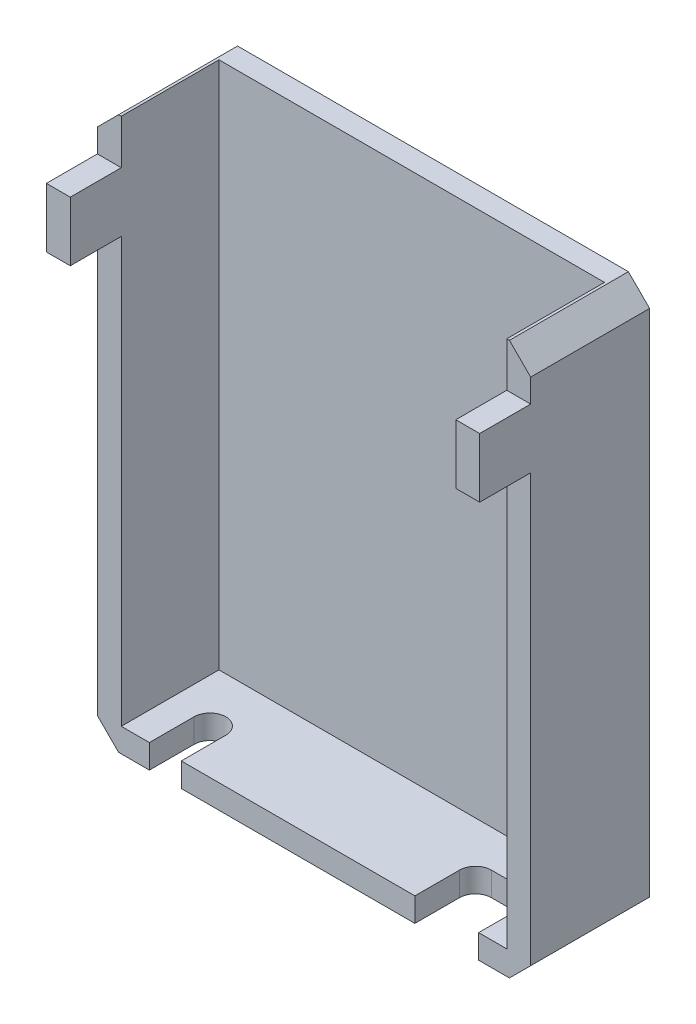
ISO-10303-21;
HEADER;
FILE_DESCRIPTION(('STEP AP214'),'2;1');
FILE_NAME('part.step','',(''),(''),'','','');
FILE_SCHEMA(('AUTOMOTIVE_DESIGN { 1 0 10303 214 1 1 1 1 }'));
ENDSEC;
DATA;
#1=APPLICATION_CONTEXT('core data for automotive mechanical design processes');
#2=APPLICATION_PROTOCOL_DEFINITION('international standard','automotive_design',2000,#1);
#3=PRODUCT_CONTEXT('',#1,'mechanical');
#4=PRODUCT('Part','Part','',(#3));
#5=PRODUCT_RELATED_PRODUCT_CATEGORY('part','',(#4));
#6=PRODUCT_DEFINITION_FORMATION('','',#4);
#7=PRODUCT_DEFINITION_CONTEXT('part definition',#1,'design');
#8=PRODUCT_DEFINITION('design','',#6,#7);
#9=PRODUCT_DEFINITION_SHAPE('','',#8);
#10=(LENGTH_UNIT() NAMED_UNIT(*) SI_UNIT(.MILLI.,.METRE.));
#11=(NAMED_UNIT(*) PLANE_ANGLE_UNIT() SI_UNIT($,.RADIAN.));
#12=(NAMED_UNIT(*) SI_UNIT($,.STERADIAN.) SOLID_ANGLE_UNIT());
#13=UNCERTAINTY_MEASURE_WITH_UNIT(LENGTH_MEASURE(1.E-05),#10,'distance_accuracy_value','');
#14=(GEOMETRIC_REPRESENTATION_CONTEXT(3) GLOBAL_UNCERTAINTY_ASSIGNED_CONTEXT((#13)) GLOBAL_UNIT_ASSIGNED_CONTEXT((#10,
#11,#12)) REPRESENTATION_CONTEXT('',''));
#15=CARTESIAN_POINT('',(0.,0.,0.));
#16=DIRECTION('',(0.,0.,1.));
#17=DIRECTION('',(1.,0.,0.));
#18=AXIS2_PLACEMENT_3D('',#15,#16,#17);
#19=CARTESIAN_POINT('',(0.,0.,5.6));
#20=DIRECTION('',(0.,0.,1.));
#21=DIRECTION('',(1.,0.,0.));
#22=AXIS2_PLACEMENT_3D('',#19,#20,#21);
#23=PLANE('',#22);
#24=DIRECTION('',(0.,-1.,0.));
#25=VECTOR('',#24,1.);
#26=CARTESIAN_POINT('',(9.07500000000001,13.,5.6));
#27=LINE('',#26,#25);
#28=CARTESIAN_POINT('',(9.07500000000001,13.,5.6));
#29=VERTEX_POINT('',#28);
#30=CARTESIAN_POINT('',(9.07500000000001,10.9,5.6));
#31=VERTEX_POINT('',#30);
#32=EDGE_CURVE('E243',#29,#31,#27,.T.);
#33=ORIENTED_EDGE('',*,*,#32,.T.);
#34=DIRECTION('',(-1.,0.,0.));
#35=VECTOR('',#34,1.);
#36=CARTESIAN_POINT('',(9.07500000000001,10.9,5.6));
#37=LINE('',#36,#35);
#38=CARTESIAN_POINT('',(10.2,10.9,5.6));
#39=VERTEX_POINT('',#38);
#40=EDGE_CURVE('E49',#39,#31,#37,.T.);
#41=ORIENTED_EDGE('',*,*,#40,.F.);
#42=DIRECTION('',(0.,1.,0.));
#43=VECTOR('',#42,1.);
#44=CARTESIAN_POINT('',(10.2,-13.,5.6));
#45=LINE('',#44,#43);
#46=CARTESIAN_POINT('',(10.2,12.,5.6));
#47=VERTEX_POINT('',#46);
#48=EDGE_CURVE('E373',#39,#47,#45,.T.);
#49=ORIENTED_EDGE('',*,*,#48,.T.);
#50=DIRECTION('',(0.707106781186546,-0.707106781186549,0.));
#51=VECTOR('',#50,1.);
#52=CARTESIAN_POINT('',(11.1,11.1,5.6));
#53=LINE('',#52,#51);
#54=CARTESIAN_POINT('',(9.2,13.,5.6));
#55=VERTEX_POINT('',#54);
#56=EDGE_CURVE('E437',#47,#55,#53,.F.);
#57=ORIENTED_EDGE('',*,*,#56,.T.);
#58=DIRECTION('',(-1.,0.,0.));
#59=VECTOR('',#58,1.);
#60=CARTESIAN_POINT('',(10.2,13.,5.6));
#61=LINE('',#60,#59);
#62=EDGE_CURVE('E244',#55,#29,#61,.T.);
#63=ORIENTED_EDGE('',*,*,#62,.T.);
#64=EDGE_LOOP('',(#33,#41,#49,#57,#63));
#65=FACE_BOUND('',#64,.T.);
#66=ADVANCED_FACE('F34',(#65),#23,.T.);
#67=CARTESIAN_POINT('',(10.2,-12.,5.6));
#68=VERTEX_POINT('',#67);
#69=CARTESIAN_POINT('',(10.2,8.10000000000001,5.6));
#70=VERTEX_POINT('',#69);
#71=EDGE_CURVE('E57',#68,#70,#45,.T.);
#72=ORIENTED_EDGE('',*,*,#71,.T.);
#73=DIRECTION('',(1.,0.,0.));
#74=VECTOR('',#73,1.);
#75=CARTESIAN_POINT('',(9.07500000000001,8.10000000000001,5.6));
#76=LINE('',#75,#74);
#77=CARTESIAN_POINT('',(9.07500000000001,8.10000000000001,5.6));
#78=VERTEX_POINT('',#77);
#79=EDGE_CURVE('E247',#78,#70,#76,.T.);
#80=ORIENTED_EDGE('',*,*,#79,.F.);
#81=CARTESIAN_POINT('',(9.07500000000001,-11.875,5.6));
#82=VERTEX_POINT('',#81);
#83=EDGE_CURVE('E232',#78,#82,#27,.T.);
#84=ORIENTED_EDGE('',*,*,#83,.T.);
#85=DIRECTION('',(-1.,0.,0.));
#86=VECTOR('',#85,1.);
#87=CARTESIAN_POINT('',(9.07500000000001,-11.875,5.6));
#88=LINE('',#87,#86);
#89=CARTESIAN_POINT('',(7.75,-11.875,5.6));
#90=VERTEX_POINT('',#89);
#91=EDGE_CURVE('E378',#82,#90,#88,.T.);
#92=ORIENTED_EDGE('',*,*,#91,.T.);
#93=DIRECTION('',(0.,-1.,0.));
#94=VECTOR('',#93,1.);
#95=CARTESIAN_POINT('',(7.75,13.001,5.6));
#96=LINE('',#95,#94);
#97=CARTESIAN_POINT('',(7.75,-13.,5.6));
#98=VERTEX_POINT('',#97);
#99=EDGE_CURVE('E323',#90,#98,#96,.T.);
#100=ORIENTED_EDGE('',*,*,#99,.T.);
#101=DIRECTION('',(1.,0.,0.));
#102=VECTOR('',#101,1.);
#103=CARTESIAN_POINT('',(-10.2,-13.,5.6));
#104=LINE('',#103,#102);
#105=CARTESIAN_POINT('',(9.2,-13.,5.6));
#106=VERTEX_POINT('',#105);
#107=EDGE_CURVE('E369',#98,#106,#104,.T.);
#108=ORIENTED_EDGE('',*,*,#107,.T.);
#109=DIRECTION('',(-0.707106781186548,-0.707106781186548,0.));
#110=VECTOR('',#109,1.);
#111=CARTESIAN_POINT('',(11.1,-11.1,5.6));
#112=LINE('',#111,#110);
#113=EDGE_CURVE('E435',#106,#68,#112,.F.);
#114=ORIENTED_EDGE('',*,*,#113,.T.);
#115=EDGE_LOOP('',(#72,#80,#84,#92,#100,#108,#114));
#116=FACE_BOUND('',#115,.T.);
#117=ADVANCED_FACE('F248',(#116),#23,.T.);
#118=DIRECTION('',(0.,-1.,0.));
#119=VECTOR('',#118,1.);
#120=CARTESIAN_POINT('',(-10.2,13.,5.6));
#121=LINE('',#120,#119);
#122=CARTESIAN_POINT('',(-10.2,12.,5.6));
#123=VERTEX_POINT('',#122);
#124=CARTESIAN_POINT('',(-10.2,10.9,5.6));
#125=VERTEX_POINT('',#124);
#126=EDGE_CURVE('E367',#123,#125,#121,.T.);
#127=ORIENTED_EDGE('',*,*,#126,.T.);
#128=DIRECTION('',(-1.,0.,0.));
#129=VECTOR('',#128,1.);
#130=CARTESIAN_POINT('',(-10.2,10.9,5.6));
#131=LINE('',#130,#129);
#132=CARTESIAN_POINT('',(-9.075,10.9,5.6));
#133=VERTEX_POINT('',#132);
#134=EDGE_CURVE('E278',#133,#125,#131,.T.);
#135=ORIENTED_EDGE('',*,*,#134,.F.);
#136=DIRECTION('',(0.,1.,0.));
#137=VECTOR('',#136,1.);
#138=CARTESIAN_POINT('',(-9.075,-11.875,5.6));
#139=LINE('',#138,#137);
#140=CARTESIAN_POINT('',(-9.075,13.,5.6));
#141=VERTEX_POINT('',#140);
#142=EDGE_CURVE('E380',#133,#141,#139,.T.);
#143=ORIENTED_EDGE('',*,*,#142,.T.);
#144=DIRECTION('',(-1.,0.,0.));
#145=VECTOR('',#144,1.);
#146=CARTESIAN_POINT('',(-9.075,13.,5.6));
#147=LINE('',#146,#145);
#148=CARTESIAN_POINT('',(-9.19999999999999,13.,5.6));
#149=VERTEX_POINT('',#148);
#150=EDGE_CURVE('E362',#141,#149,#147,.T.);
#151=ORIENTED_EDGE('',*,*,#150,.T.);
#152=DIRECTION('',(0.707106781186548,0.707106781186548,0.));
#153=VECTOR('',#152,1.);
#154=CARTESIAN_POINT('',(-11.1,11.1,5.6));
#155=LINE('',#154,#153);
#156=EDGE_CURVE('E439',#149,#123,#155,.F.);
#157=ORIENTED_EDGE('',*,*,#156,.T.);
#158=EDGE_LOOP('',(#127,#135,#143,#151,#157));
#159=FACE_BOUND('',#158,.T.);
#160=ADVANCED_FACE('F552',(#159),#23,.T.);
#161=CARTESIAN_POINT('',(-9.075,-11.875,5.6));
#162=VERTEX_POINT('',#161);
#163=CARTESIAN_POINT('',(-9.075,8.10000000000001,5.6));
#164=VERTEX_POINT('',#163);
#165=EDGE_CURVE('E382',#162,#164,#139,.T.);
#166=ORIENTED_EDGE('',*,*,#165,.T.);
#167=DIRECTION('',(1.,0.,0.));
#168=VECTOR('',#167,1.);
#169=CARTESIAN_POINT('',(-10.2,8.10000000000001,5.6));
#170=LINE('',#169,#168);
#171=CARTESIAN_POINT('',(-10.2,8.10000000000001,5.6));
#172=VERTEX_POINT('',#171);
#173=EDGE_CURVE('E275',#172,#164,#170,.T.);
#174=ORIENTED_EDGE('',*,*,#173,.F.);
#175=CARTESIAN_POINT('',(-10.2,-12.,5.6));
#176=VERTEX_POINT('',#175);
#177=EDGE_CURVE('E365',#172,#176,#121,.T.);
#178=ORIENTED_EDGE('',*,*,#177,.T.);
#179=DIRECTION('',(-0.707106781186546,0.707106781186549,0.));
#180=VECTOR('',#179,1.);
#181=CARTESIAN_POINT('',(-11.1,-11.1,5.6));
#182=LINE('',#181,#180);
#183=CARTESIAN_POINT('',(-9.19999999999999,-13.,5.6));
#184=VERTEX_POINT('',#183);
#185=EDGE_CURVE('E433',#176,#184,#182,.F.);
#186=ORIENTED_EDGE('',*,*,#185,.T.);
#187=CARTESIAN_POINT('',(-7.75,-13.,5.6));
#188=VERTEX_POINT('',#187);
#189=EDGE_CURVE('E370',#184,#188,#104,.T.);
#190=ORIENTED_EDGE('',*,*,#189,.T.);
#191=DIRECTION('',(0.,-1.,0.));
#192=VECTOR('',#191,1.);
#193=CARTESIAN_POINT('',(-7.75,13.001,5.6));
#194=LINE('',#193,#192);
#195=CARTESIAN_POINT('',(-7.75,-11.875,5.6));
#196=VERTEX_POINT('',#195);
#197=EDGE_CURVE('E350',#196,#188,#194,.T.);
#198=ORIENTED_EDGE('',*,*,#197,.F.);
#199=EDGE_CURVE('E377',#196,#162,#88,.T.);
#200=ORIENTED_EDGE('',*,*,#199,.T.);
#201=EDGE_LOOP('',(#166,#174,#178,#186,#190,#198,#200));
#202=FACE_BOUND('',#201,.T.);
#203=ADVANCED_FACE('F529',(#202),#23,.T.);
#204=CARTESIAN_POINT('',(-10.2,13.,1.));
#205=DIRECTION('',(1.,0.,0.));
#206=DIRECTION('',(0.,1.,0.));
#207=AXIS2_PLACEMENT_3D('',#204,#205,#206);
#208=PLANE('',#207);
#209=ORIENTED_EDGE('',*,*,#126,.F.);
#210=DIRECTION('',(0.,0.,-1.));
#211=VECTOR('',#210,1.);
#212=CARTESIAN_POINT('',(-10.2,12.,1.));
#213=LINE('',#212,#211);
#214=CARTESIAN_POINT('',(-10.2,12.,0.));
#215=VERTEX_POINT('',#214);
#216=EDGE_CURVE('E417',#123,#215,#213,.T.);
#217=ORIENTED_EDGE('',*,*,#216,.T.);
#218=DIRECTION('',(0.,-1.,0.));
#219=VECTOR('',#218,1.);
#220=CARTESIAN_POINT('',(-10.2,13.,0.));
#221=LINE('',#220,#219);
#222=CARTESIAN_POINT('',(-10.2,-12.,0.));
#223=VERTEX_POINT('',#222);
#224=EDGE_CURVE('E400',#215,#223,#221,.T.);
#225=ORIENTED_EDGE('',*,*,#224,.T.);
#226=DIRECTION('',(0.,0.,1.));
#227=VECTOR('',#226,1.);
#228=CARTESIAN_POINT('',(-10.2,-12.,1.));
#229=LINE('',#228,#227);
#230=EDGE_CURVE('E403',#223,#176,#229,.T.);
#231=ORIENTED_EDGE('',*,*,#230,.T.);
#232=ORIENTED_EDGE('',*,*,#177,.F.);
#233=DIRECTION('',(0.,0.,-1.));
#234=VECTOR('',#233,1.);
#235=CARTESIAN_POINT('',(-10.2,8.10000000000001,11.1175528164392));
#236=LINE('',#235,#234);
#237=CARTESIAN_POINT('',(-10.2,8.10000000000001,8.));
#238=VERTEX_POINT('',#237);
#239=EDGE_CURVE('E291',#238,#172,#236,.T.);
#240=ORIENTED_EDGE('',*,*,#239,.F.);
#241=DIRECTION('',(0.,1.,0.));
#242=VECTOR('',#241,1.);
#243=CARTESIAN_POINT('',(-10.2,10.9,8.));
#244=LINE('',#243,#242);
#245=CARTESIAN_POINT('',(-10.2,10.9,8.));
#246=VERTEX_POINT('',#245);
#247=EDGE_CURVE('E271',#238,#246,#244,.T.);
#248=ORIENTED_EDGE('',*,*,#247,.T.);
#249=DIRECTION('',(0.,0.,-1.));
#250=VECTOR('',#249,1.);
#251=CARTESIAN_POINT('',(-10.2,10.9,11.1175528164392));
#252=LINE('',#251,#250);
#253=EDGE_CURVE('E282',#246,#125,#252,.T.);
#254=ORIENTED_EDGE('',*,*,#253,.T.);
#255=EDGE_LOOP('',(#209,#217,#225,#231,#232,#240,#248,#254));
#256=FACE_BOUND('',#255,.T.);
#257=ADVANCED_FACE('F566',(#256),#208,.F.);
#258=CARTESIAN_POINT('',(-10.2,-13.,1.));
#259=DIRECTION('',(0.,1.,0.));
#260=DIRECTION('',(0.,0.,1.));
#261=AXIS2_PLACEMENT_3D('',#258,#259,#260);
#262=PLANE('',#261);
#263=ORIENTED_EDGE('',*,*,#107,.F.);
#264=DIRECTION('',(0.,0.,1.));
#265=VECTOR('',#264,1.);
#266=CARTESIAN_POINT('',(7.75,-13.,3.5));
#267=LINE('',#266,#265);
#268=CARTESIAN_POINT('',(7.75,-13.,3.5));
#269=VERTEX_POINT('',#268);
#270=EDGE_CURVE('E309',#269,#98,#267,.T.);
#271=ORIENTED_EDGE('',*,*,#270,.F.);
#272=CARTESIAN_POINT('',(7.,-13.,3.5));
#273=DIRECTION('',(0.,-1.,0.));
#274=DIRECTION('',(0.,0.,-1.));
#275=AXIS2_PLACEMENT_3D('',#272,#273,#274);
#276=CIRCLE('',#275,0.75);
#277=CARTESIAN_POINT('',(7.,-13.,2.75));
#278=VERTEX_POINT('',#277);
#279=EDGE_CURVE('E320',#278,#269,#276,.T.);
#280=ORIENTED_EDGE('',*,*,#279,.F.);
#281=DIRECTION('',(1.,0.,0.));
#282=VECTOR('',#281,1.);
#283=CARTESIAN_POINT('',(7.,-13.,2.75));
#284=LINE('',#283,#282);
#285=CARTESIAN_POINT('',(5.5,-13.,2.75));
#286=VERTEX_POINT('',#285);
#287=EDGE_CURVE('E317',#286,#278,#284,.T.);
#288=ORIENTED_EDGE('',*,*,#287,.F.);
#289=CARTESIAN_POINT('',(5.5,-13.,3.5));
#290=DIRECTION('',(0.,-1.,0.));
#291=DIRECTION('',(0.,0.,-1.));
#292=AXIS2_PLACEMENT_3D('',#289,#290,#291);
#293=CIRCLE('',#292,0.75);
#294=CARTESIAN_POINT('',(4.75,-13.,3.5));
#295=VERTEX_POINT('',#294);
#296=EDGE_CURVE('E314',#295,#286,#293,.T.);
#297=ORIENTED_EDGE('',*,*,#296,.F.);
#298=DIRECTION('',(0.,0.,-1.));
#299=VECTOR('',#298,1.);
#300=CARTESIAN_POINT('',(4.75,-13.,5.6));
#301=LINE('',#300,#299);
#302=CARTESIAN_POINT('',(4.75,-13.,5.6));
#303=VERTEX_POINT('',#302);
#304=EDGE_CURVE('E311',#303,#295,#301,.T.);
#305=ORIENTED_EDGE('',*,*,#304,.F.);
#306=CARTESIAN_POINT('',(-6.25,-13.,5.6));
#307=VERTEX_POINT('',#306);
#308=EDGE_CURVE('E374',#307,#303,#104,.T.);
#309=ORIENTED_EDGE('',*,*,#308,.F.);
#310=DIRECTION('',(0.,0.,1.));
#311=VECTOR('',#310,1.);
#312=CARTESIAN_POINT('',(-6.25,-13.,5.6));
#313=LINE('',#312,#311);
#314=CARTESIAN_POINT('',(-6.25,-13.,3.5));
#315=VERTEX_POINT('',#314);
#316=EDGE_CURVE('E347',#315,#307,#313,.T.);
#317=ORIENTED_EDGE('',*,*,#316,.F.);
#318=CARTESIAN_POINT('',(-7.,-13.,3.5));
#319=DIRECTION('',(0.,-1.,0.));
#320=DIRECTION('',(0.,0.,-1.));
#321=AXIS2_PLACEMENT_3D('',#318,#319,#320);
#322=CIRCLE('',#321,0.75);
#323=CARTESIAN_POINT('',(-7.75,-13.,3.5));
#324=VERTEX_POINT('',#323);
#325=EDGE_CURVE('E344',#324,#315,#322,.T.);
#326=ORIENTED_EDGE('',*,*,#325,.F.);
#327=DIRECTION('',(0.,0.,-1.));
#328=VECTOR('',#327,1.);
#329=CARTESIAN_POINT('',(-7.75,-13.,5.6));
#330=LINE('',#329,#328);
#331=EDGE_CURVE('E341',#188,#324,#330,.T.);
#332=ORIENTED_EDGE('',*,*,#331,.F.);
#333=ORIENTED_EDGE('',*,*,#189,.F.);
#334=DIRECTION('',(0.,0.,-1.));
#335=VECTOR('',#334,1.);
#336=CARTESIAN_POINT('',(-9.19999999999999,-13.,1.));
#337=LINE('',#336,#335);
#338=CARTESIAN_POINT('',(-9.19999999999999,-13.,0.));
#339=VERTEX_POINT('',#338);
#340=EDGE_CURVE('E42',#184,#339,#337,.T.);
#341=ORIENTED_EDGE('',*,*,#340,.T.);
#342=DIRECTION('',(1.,0.,0.));
#343=VECTOR('',#342,1.);
#344=CARTESIAN_POINT('',(-10.2,-13.,0.));
#345=LINE('',#344,#343);
#346=CARTESIAN_POINT('',(9.2,-13.,0.));
#347=VERTEX_POINT('',#346);
#348=EDGE_CURVE('E407',#339,#347,#345,.T.);
#349=ORIENTED_EDGE('',*,*,#348,.T.);
#350=DIRECTION('',(0.,0.,1.));
#351=VECTOR('',#350,1.);
#352=CARTESIAN_POINT('',(9.2,-13.,1.));
#353=LINE('',#352,#351);
#354=EDGE_CURVE('E12',#347,#106,#353,.T.);
#355=ORIENTED_EDGE('',*,*,#354,.T.);
#356=EDGE_LOOP('',(#263,#271,#280,#288,#297,#305,#309,#317,#326,#332,#333,#341,#349,#355));
#357=FACE_BOUND('',#356,.T.);
#358=ADVANCED_FACE('F452',(#357),#262,.F.);
#359=CARTESIAN_POINT('',(10.2,13.,1.));
#360=DIRECTION('',(-1.,0.,0.));
#361=DIRECTION('',(0.,0.,1.));
#362=AXIS2_PLACEMENT_3D('',#359,#360,#361);
#363=PLANE('',#362);
#364=DIRECTION('',(0.,1.,0.));
#365=VECTOR('',#364,1.);
#366=CARTESIAN_POINT('',(10.2,13.,0.));
#367=LINE('',#366,#365);
#368=CARTESIAN_POINT('',(10.2,-12.,0.));
#369=VERTEX_POINT('',#368);
#370=CARTESIAN_POINT('',(10.2,12.,0.));
#371=VERTEX_POINT('',#370);
#372=EDGE_CURVE('E410',#369,#371,#367,.T.);
#373=ORIENTED_EDGE('',*,*,#372,.T.);
#374=DIRECTION('',(0.,0.,1.));
#375=VECTOR('',#374,1.);
#376=CARTESIAN_POINT('',(10.2,12.,1.));
#377=LINE('',#376,#375);
#378=EDGE_CURVE('E444',#371,#47,#377,.T.);
#379=ORIENTED_EDGE('',*,*,#378,.T.);
#380=ORIENTED_EDGE('',*,*,#48,.F.);
#381=DIRECTION('',(0.,0.,-1.));
#382=VECTOR('',#381,1.);
#383=CARTESIAN_POINT('',(10.2,10.9,11.1175528164392));
#384=LINE('',#383,#382);
#385=CARTESIAN_POINT('',(10.2,10.9,8.));
#386=VERTEX_POINT('',#385);
#387=EDGE_CURVE('E260',#386,#39,#384,.T.);
#388=ORIENTED_EDGE('',*,*,#387,.F.);
#389=DIRECTION('',(0.,-1.,0.));
#390=VECTOR('',#389,1.);
#391=CARTESIAN_POINT('',(10.2,10.9,8.));
#392=LINE('',#391,#390);
#393=CARTESIAN_POINT('',(10.2,8.10000000000001,8.));
#394=VERTEX_POINT('',#393);
#395=EDGE_CURVE('E258',#386,#394,#392,.T.);
#396=ORIENTED_EDGE('',*,*,#395,.T.);
#397=DIRECTION('',(0.,0.,-1.));
#398=VECTOR('',#397,1.);
#399=CARTESIAN_POINT('',(10.2,8.10000000000001,11.1175528164392));
#400=LINE('',#399,#398);
#401=EDGE_CURVE('E255',#394,#70,#400,.T.);
#402=ORIENTED_EDGE('',*,*,#401,.T.);
#403=ORIENTED_EDGE('',*,*,#71,.F.);
#404=DIRECTION('',(0.,0.,-1.));
#405=VECTOR('',#404,1.);
#406=CARTESIAN_POINT('',(10.2,-12.,1.));
#407=LINE('',#406,#405);
#408=EDGE_CURVE('E441',#68,#369,#407,.T.);
#409=ORIENTED_EDGE('',*,*,#408,.T.);
#410=EDGE_LOOP('',(#373,#379,#380,#388,#396,#402,#403,#409));
#411=FACE_BOUND('',#410,.T.);
#412=ADVANCED_FACE('F466',(#411),#363,.F.);
#413=CARTESIAN_POINT('',(-10.2,13.,1.));
#414=DIRECTION('',(0.,-1.,0.));
#415=DIRECTION('',(0.,0.,-1.));
#416=AXIS2_PLACEMENT_3D('',#413,#414,#415);
#417=PLANE('',#416);
#418=DIRECTION('',(-1.,0.,0.));
#419=VECTOR('',#418,1.);
#420=CARTESIAN_POINT('',(-10.2,13.,0.));
#421=LINE('',#420,#419);
#422=CARTESIAN_POINT('',(9.2,13.,0.));
#423=VERTEX_POINT('',#422);
#424=CARTESIAN_POINT('',(-9.19999999999999,13.,0.));
#425=VERTEX_POINT('',#424);
#426=EDGE_CURVE('E404',#423,#425,#421,.T.);
#427=ORIENTED_EDGE('',*,*,#426,.T.);
#428=DIRECTION('',(0.,0.,1.));
#429=VECTOR('',#428,1.);
#430=CARTESIAN_POINT('',(-9.19999999999999,13.,1.));
#431=LINE('',#430,#429);
#432=EDGE_CURVE('E431',#425,#149,#431,.T.);
#433=ORIENTED_EDGE('',*,*,#432,.T.);
#434=ORIENTED_EDGE('',*,*,#150,.F.);
#435=DIRECTION('',(0.,0.,-1.));
#436=VECTOR('',#435,1.);
#437=CARTESIAN_POINT('',(-9.075,13.,5.6));
#438=LINE('',#437,#436);
#439=CARTESIAN_POINT('',(-9.075,13.,1.));
#440=VERTEX_POINT('',#439);
#441=EDGE_CURVE('E384',#141,#440,#438,.T.);
#442=ORIENTED_EDGE('',*,*,#441,.T.);
#443=DIRECTION('',(-1.,0.,0.));
#444=VECTOR('',#443,1.);
#445=CARTESIAN_POINT('',(-10.2,13.,1.));
#446=LINE('',#445,#444);
#447=CARTESIAN_POINT('',(9.07500000000001,13.,1.));
#448=VERTEX_POINT('',#447);
#449=EDGE_CURVE('E401',#448,#440,#446,.T.);
#450=ORIENTED_EDGE('',*,*,#449,.F.);
#451=DIRECTION('',(0.,0.,-1.));
#452=VECTOR('',#451,1.);
#453=CARTESIAN_POINT('',(9.07500000000001,13.,5.6));
#454=LINE('',#453,#452);
#455=EDGE_CURVE('E397',#29,#448,#454,.T.);
#456=ORIENTED_EDGE('',*,*,#455,.F.);
#457=ORIENTED_EDGE('',*,*,#62,.F.);
#458=DIRECTION('',(0.,0.,-1.));
#459=VECTOR('',#458,1.);
#460=CARTESIAN_POINT('',(9.2,13.,1.));
#461=LINE('',#460,#459);
#462=EDGE_CURVE('E428',#55,#423,#461,.T.);
#463=ORIENTED_EDGE('',*,*,#462,.T.);
#464=EDGE_LOOP('',(#427,#433,#434,#442,#450,#456,#457,#463));
#465=FACE_BOUND('',#464,.T.);
#466=ADVANCED_FACE('F490',(#465),#417,.F.);
#467=CARTESIAN_POINT('',(0.,0.,1.));
#468=DIRECTION('',(0.,0.,1.));
#469=DIRECTION('',(1.,0.,0.));
#470=AXIS2_PLACEMENT_3D('',#467,#468,#469);
#471=PLANE('',#470);
#472=DIRECTION('',(0.,1.,0.));
#473=VECTOR('',#472,1.);
#474=CARTESIAN_POINT('',(-9.075,-11.875,1.));
#475=LINE('',#474,#473);
#476=CARTESIAN_POINT('',(-9.075,-11.875,1.));
#477=VERTEX_POINT('',#476);
#478=EDGE_CURVE('E366',#477,#440,#475,.T.);
#479=ORIENTED_EDGE('',*,*,#478,.F.);
#480=DIRECTION('',(-1.,0.,0.));
#481=VECTOR('',#480,1.);
#482=CARTESIAN_POINT('',(9.07500000000001,-11.875,1.));
#483=LINE('',#482,#481);
#484=CARTESIAN_POINT('',(9.07500000000001,-11.875,1.));
#485=VERTEX_POINT('',#484);
#486=EDGE_CURVE('E386',#485,#477,#483,.T.);
#487=ORIENTED_EDGE('',*,*,#486,.F.);
#488=DIRECTION('',(0.,-1.,0.));
#489=VECTOR('',#488,1.);
#490=CARTESIAN_POINT('',(9.07500000000001,13.,1.));
#491=LINE('',#490,#489);
#492=EDGE_CURVE('E361',#448,#485,#491,.T.);
#493=ORIENTED_EDGE('',*,*,#492,.F.);
#494=ORIENTED_EDGE('',*,*,#449,.T.);
#495=EDGE_LOOP('',(#479,#487,#493,#494));
#496=FACE_BOUND('',#495,.T.);
#497=ADVANCED_FACE('F494',(#496),#471,.T.);
#498=CARTESIAN_POINT('',(0.,0.,0.));
#499=DIRECTION('',(0.,0.,1.));
#500=DIRECTION('',(1.,0.,0.));
#501=AXIS2_PLACEMENT_3D('',#498,#499,#500);
#502=PLANE('',#501);
#503=ORIENTED_EDGE('',*,*,#224,.F.);
#504=DIRECTION('',(-0.707106781186548,-0.707106781186548,0.));
#505=VECTOR('',#504,1.);
#506=CARTESIAN_POINT('',(-10.2,12.,0.));
#507=LINE('',#506,#505);
#508=EDGE_CURVE('E426',#215,#425,#507,.F.);
#509=ORIENTED_EDGE('',*,*,#508,.T.);
#510=ORIENTED_EDGE('',*,*,#426,.F.);
#511=DIRECTION('',(-0.707106781186546,0.707106781186549,0.));
#512=VECTOR('',#511,1.);
#513=CARTESIAN_POINT('',(9.2,13.,0.));
#514=LINE('',#513,#512);
#515=EDGE_CURVE('E424',#423,#371,#514,.F.);
#516=ORIENTED_EDGE('',*,*,#515,.T.);
#517=ORIENTED_EDGE('',*,*,#372,.F.);
#518=DIRECTION('',(0.707106781186548,0.707106781186548,0.));
#519=VECTOR('',#518,1.);
#520=CARTESIAN_POINT('',(10.2,-12.,0.));
#521=LINE('',#520,#519);
#522=EDGE_CURVE('E422',#369,#347,#521,.F.);
#523=ORIENTED_EDGE('',*,*,#522,.T.);
#524=ORIENTED_EDGE('',*,*,#348,.F.);
#525=DIRECTION('',(0.707106781186546,-0.707106781186549,0.));
#526=VECTOR('',#525,1.);
#527=CARTESIAN_POINT('',(-9.19999999999999,-13.,0.));
#528=LINE('',#527,#526);
#529=EDGE_CURVE('E420',#339,#223,#528,.F.);
#530=ORIENTED_EDGE('',*,*,#529,.T.);
#531=EDGE_LOOP('',(#503,#509,#510,#516,#517,#523,#524,#530));
#532=FACE_BOUND('',#531,.T.);
#533=ADVANCED_FACE('F459',(#532),#502,.F.);
#534=CARTESIAN_POINT('',(9.07500000000001,13.,5.6));
#535=DIRECTION('',(1.,0.,0.));
#536=DIRECTION('',(0.,1.,0.));
#537=AXIS2_PLACEMENT_3D('',#534,#535,#536);
#538=PLANE('',#537);
#539=ORIENTED_EDGE('',*,*,#492,.T.);
#540=DIRECTION('',(0.,0.,-1.));
#541=VECTOR('',#540,1.);
#542=CARTESIAN_POINT('',(9.07500000000001,-11.875,5.6));
#543=LINE('',#542,#541);
#544=EDGE_CURVE('E240',#82,#485,#543,.T.);
#545=ORIENTED_EDGE('',*,*,#544,.F.);
#546=ORIENTED_EDGE('',*,*,#83,.F.);
#547=DIRECTION('',(0.,0.,-1.));
#548=VECTOR('',#547,1.);
#549=CARTESIAN_POINT('',(9.07500000000001,8.10000000000001,11.1175528164392));
#550=LINE('',#549,#548);
#551=CARTESIAN_POINT('',(9.07500000000001,8.10000000000001,8.));
#552=VERTEX_POINT('',#551);
#553=EDGE_CURVE('E237',#552,#78,#550,.T.);
#554=ORIENTED_EDGE('',*,*,#553,.F.);
#555=DIRECTION('',(0.,1.,0.));
#556=VECTOR('',#555,1.);
#557=CARTESIAN_POINT('',(9.07500000000001,10.9,8.));
#558=LINE('',#557,#556);
#559=CARTESIAN_POINT('',(9.07500000000001,10.9,8.));
#560=VERTEX_POINT('',#559);
#561=EDGE_CURVE('E279',#552,#560,#558,.T.);
#562=ORIENTED_EDGE('',*,*,#561,.T.);
#563=DIRECTION('',(0.,0.,-1.));
#564=VECTOR('',#563,1.);
#565=CARTESIAN_POINT('',(9.07500000000001,10.9,11.1175528164392));
#566=LINE('',#565,#564);
#567=EDGE_CURVE('E477',#560,#31,#566,.T.);
#568=ORIENTED_EDGE('',*,*,#567,.T.);
#569=ORIENTED_EDGE('',*,*,#32,.F.);
#570=ORIENTED_EDGE('',*,*,#455,.T.);
#571=EDGE_LOOP('',(#539,#545,#546,#554,#562,#568,#569,#570));
#572=FACE_BOUND('',#571,.T.);
#573=ADVANCED_FACE('F234',(#572),#538,.F.);
#574=CARTESIAN_POINT('',(9.07500000000001,-11.875,5.6));
#575=DIRECTION('',(0.,-1.,0.));
#576=DIRECTION('',(1.,0.,0.));
#577=AXIS2_PLACEMENT_3D('',#574,#575,#576);
#578=PLANE('',#577);
#579=CARTESIAN_POINT('',(7.,-11.875,3.5));
#580=DIRECTION('',(0.,-1.,0.));
#581=DIRECTION('',(1.,0.,0.));
#582=AXIS2_PLACEMENT_3D('',#579,#580,#581);
#583=CIRCLE('',#582,0.75);
#584=CARTESIAN_POINT('',(7.75,-11.875,3.5));
#585=VERTEX_POINT('',#584);
#586=CARTESIAN_POINT('',(7.,-11.875,2.75));
#587=VERTEX_POINT('',#586);
#588=EDGE_CURVE('E303',#585,#587,#583,.F.);
#589=ORIENTED_EDGE('',*,*,#588,.F.);
#590=DIRECTION('',(0.,0.,-1.));
#591=VECTOR('',#590,1.);
#592=CARTESIAN_POINT('',(7.75,-11.875,3.5));
#593=LINE('',#592,#591);
#594=EDGE_CURVE('E306',#90,#585,#593,.T.);
#595=ORIENTED_EDGE('',*,*,#594,.F.);
#596=ORIENTED_EDGE('',*,*,#91,.F.);
#597=ORIENTED_EDGE('',*,*,#544,.T.);
#598=ORIENTED_EDGE('',*,*,#486,.T.);
#599=DIRECTION('',(0.,0.,-1.));
#600=VECTOR('',#599,1.);
#601=CARTESIAN_POINT('',(-9.075,-11.875,5.6));
#602=LINE('',#601,#600);
#603=EDGE_CURVE('E393',#162,#477,#602,.T.);
#604=ORIENTED_EDGE('',*,*,#603,.F.);
#605=ORIENTED_EDGE('',*,*,#199,.F.);
#606=DIRECTION('',(0.,0.,1.));
#607=VECTOR('',#606,1.);
#608=CARTESIAN_POINT('',(-7.75,-11.875,5.6));
#609=LINE('',#608,#607);
#610=CARTESIAN_POINT('',(-7.75,-11.875,3.5));
#611=VERTEX_POINT('',#610);
#612=EDGE_CURVE('E339',#611,#196,#609,.T.);
#613=ORIENTED_EDGE('',*,*,#612,.F.);
#614=CARTESIAN_POINT('',(-7.,-11.875,3.5));
#615=DIRECTION('',(0.,-1.,0.));
#616=DIRECTION('',(1.,0.,0.));
#617=AXIS2_PLACEMENT_3D('',#614,#615,#616);
#618=CIRCLE('',#617,0.75);
#619=CARTESIAN_POINT('',(-6.25,-11.875,3.5));
#620=VERTEX_POINT('',#619);
#621=EDGE_CURVE('E352',#620,#611,#618,.F.);
#622=ORIENTED_EDGE('',*,*,#621,.F.);
#623=DIRECTION('',(0.,0.,-1.));
#624=VECTOR('',#623,1.);
#625=CARTESIAN_POINT('',(-6.25,-11.875,5.6));
#626=LINE('',#625,#624);
#627=CARTESIAN_POINT('',(-6.25,-11.875,5.6));
#628=VERTEX_POINT('',#627);
#629=EDGE_CURVE('E326',#628,#620,#626,.T.);
#630=ORIENTED_EDGE('',*,*,#629,.F.);
#631=CARTESIAN_POINT('',(4.75,-11.875,5.6));
#632=VERTEX_POINT('',#631);
#633=EDGE_CURVE('E381',#632,#628,#88,.T.);
#634=ORIENTED_EDGE('',*,*,#633,.F.);
#635=DIRECTION('',(0.,0.,1.));
#636=VECTOR('',#635,1.);
#637=CARTESIAN_POINT('',(4.75,-11.875,5.6));
#638=LINE('',#637,#636);
#639=CARTESIAN_POINT('',(4.75,-11.875,3.5));
#640=VERTEX_POINT('',#639);
#641=EDGE_CURVE('E274',#640,#632,#638,.T.);
#642=ORIENTED_EDGE('',*,*,#641,.F.);
#643=CARTESIAN_POINT('',(5.5,-11.875,3.5));
#644=DIRECTION('',(0.,-1.,0.));
#645=DIRECTION('',(1.,0.,0.));
#646=AXIS2_PLACEMENT_3D('',#643,#644,#645);
#647=CIRCLE('',#646,0.75);
#648=CARTESIAN_POINT('',(5.5,-11.875,2.75));
#649=VERTEX_POINT('',#648);
#650=EDGE_CURVE('E297',#649,#640,#647,.F.);
#651=ORIENTED_EDGE('',*,*,#650,.F.);
#652=DIRECTION('',(-1.,0.,0.));
#653=VECTOR('',#652,1.);
#654=CARTESIAN_POINT('',(7.,-11.875,2.75));
#655=LINE('',#654,#653);
#656=EDGE_CURVE('E300',#587,#649,#655,.T.);
#657=ORIENTED_EDGE('',*,*,#656,.F.);
#658=EDGE_LOOP('',(#589,#595,#596,#597,#598,#604,#605,#613,#622,#630,#634,#642,#651,#657));
#659=FACE_BOUND('',#658,.T.);
#660=ADVANCED_FACE('F502',(#659),#578,.F.);
#661=CARTESIAN_POINT('',(-9.075,-11.875,5.6));
#662=DIRECTION('',(-1.,0.,0.));
#663=DIRECTION('',(0.,0.,1.));
#664=AXIS2_PLACEMENT_3D('',#661,#662,#663);
#665=PLANE('',#664);
#666=ORIENTED_EDGE('',*,*,#478,.T.);
#667=ORIENTED_EDGE('',*,*,#441,.F.);
#668=ORIENTED_EDGE('',*,*,#142,.F.);
#669=DIRECTION('',(0.,0.,-1.));
#670=VECTOR('',#669,1.);
#671=CARTESIAN_POINT('',(-9.075,10.9,11.1175528164392));
#672=LINE('',#671,#670);
#673=CARTESIAN_POINT('',(-9.075,10.9,8.));
#674=VERTEX_POINT('',#673);
#675=EDGE_CURVE('E285',#674,#133,#672,.T.);
#676=ORIENTED_EDGE('',*,*,#675,.F.);
#677=DIRECTION('',(0.,-1.,0.));
#678=VECTOR('',#677,1.);
#679=CARTESIAN_POINT('',(-9.075,10.9,8.));
#680=LINE('',#679,#678);
#681=CARTESIAN_POINT('',(-9.075,8.10000000000001,8.));
#682=VERTEX_POINT('',#681);
#683=EDGE_CURVE('E264',#674,#682,#680,.T.);
#684=ORIENTED_EDGE('',*,*,#683,.T.);
#685=DIRECTION('',(0.,0.,-1.));
#686=VECTOR('',#685,1.);
#687=CARTESIAN_POINT('',(-9.075,8.10000000000001,11.1175528164392));
#688=LINE('',#687,#686);
#689=EDGE_CURVE('E288',#682,#164,#688,.T.);
#690=ORIENTED_EDGE('',*,*,#689,.T.);
#691=ORIENTED_EDGE('',*,*,#165,.F.);
#692=ORIENTED_EDGE('',*,*,#603,.T.);
#693=EDGE_LOOP('',(#666,#667,#668,#676,#684,#690,#691,#692));
#694=FACE_BOUND('',#693,.T.);
#695=ADVANCED_FACE('F496',(#694),#665,.F.);
#696=DIRECTION('',(0.,-1.,0.));
#697=VECTOR('',#696,1.);
#698=CARTESIAN_POINT('',(4.75,13.001,5.6));
#699=LINE('',#698,#697);
#700=EDGE_CURVE('E333',#632,#303,#699,.T.);
#701=ORIENTED_EDGE('',*,*,#700,.F.);
#702=ORIENTED_EDGE('',*,*,#633,.T.);
#703=DIRECTION('',(0.,-1.,0.));
#704=VECTOR('',#703,1.);
#705=CARTESIAN_POINT('',(-6.25,13.001,5.6));
#706=LINE('',#705,#704);
#707=EDGE_CURVE('E353',#628,#307,#706,.T.);
#708=ORIENTED_EDGE('',*,*,#707,.T.);
#709=ORIENTED_EDGE('',*,*,#308,.T.);
#710=EDGE_LOOP('',(#701,#702,#708,#709));
#711=FACE_BOUND('',#710,.T.);
#712=ADVANCED_FACE('F512',(#711),#23,.T.);
#713=CARTESIAN_POINT('',(-10.2,12.,1.));
#714=DIRECTION('',(0.707106781186547,-0.707106781186547,0.));
#715=DIRECTION('',(0.,0.,-1.));
#716=AXIS2_PLACEMENT_3D('',#713,#714,#715);
#717=PLANE('',#716);
#718=ORIENTED_EDGE('',*,*,#156,.F.);
#719=ORIENTED_EDGE('',*,*,#432,.F.);
#720=ORIENTED_EDGE('',*,*,#508,.F.);
#721=ORIENTED_EDGE('',*,*,#216,.F.);
#722=EDGE_LOOP('',(#718,#719,#720,#721));
#723=FACE_BOUND('',#722,.T.);
#724=ADVANCED_FACE('F555',(#723),#717,.F.);
#725=CARTESIAN_POINT('',(9.2,13.,1.));
#726=DIRECTION('',(-0.707106781186549,-0.707106781186546,0.));
#727=DIRECTION('',(0.,0.,-1.));
#728=AXIS2_PLACEMENT_3D('',#725,#726,#727);
#729=PLANE('',#728);
#730=ORIENTED_EDGE('',*,*,#56,.F.);
#731=ORIENTED_EDGE('',*,*,#378,.F.);
#732=ORIENTED_EDGE('',*,*,#515,.F.);
#733=ORIENTED_EDGE('',*,*,#462,.F.);
#734=EDGE_LOOP('',(#730,#731,#732,#733));
#735=FACE_BOUND('',#734,.T.);
#736=ADVANCED_FACE('F561',(#735),#729,.F.);
#737=CARTESIAN_POINT('',(10.2,-12.,1.));
#738=DIRECTION('',(-0.707106781186547,0.707106781186547,0.));
#739=DIRECTION('',(0.,0.,-1.));
#740=AXIS2_PLACEMENT_3D('',#737,#738,#739);
#741=PLANE('',#740);
#742=ORIENTED_EDGE('',*,*,#113,.F.);
#743=ORIENTED_EDGE('',*,*,#354,.F.);
#744=ORIENTED_EDGE('',*,*,#522,.F.);
#745=ORIENTED_EDGE('',*,*,#408,.F.);
#746=EDGE_LOOP('',(#742,#743,#744,#745));
#747=FACE_BOUND('',#746,.T.);
#748=ADVANCED_FACE('F464',(#747),#741,.F.);
#749=CARTESIAN_POINT('',(-9.19999999999999,-13.,1.));
#750=DIRECTION('',(0.707106781186549,0.707106781186546,0.));
#751=DIRECTION('',(0.,0.,-1.));
#752=AXIS2_PLACEMENT_3D('',#749,#750,#751);
#753=PLANE('',#752);
#754=ORIENTED_EDGE('',*,*,#185,.F.);
#755=ORIENTED_EDGE('',*,*,#230,.F.);
#756=ORIENTED_EDGE('',*,*,#529,.F.);
#757=ORIENTED_EDGE('',*,*,#340,.F.);
#758=EDGE_LOOP('',(#754,#755,#756,#757));
#759=FACE_BOUND('',#758,.T.);
#760=ADVANCED_FACE('F36',(#759),#753,.F.);
#761=CARTESIAN_POINT('',(-7.75,13.001,5.6));
#762=DIRECTION('',(-1.,0.,0.));
#763=DIRECTION('',(0.,0.,1.));
#764=AXIS2_PLACEMENT_3D('',#761,#762,#763);
#765=PLANE('',#764);
#766=ORIENTED_EDGE('',*,*,#612,.T.);
#767=ORIENTED_EDGE('',*,*,#197,.T.);
#768=ORIENTED_EDGE('',*,*,#331,.T.);
#769=DIRECTION('',(0.,-1.,0.));
#770=VECTOR('',#769,1.);
#771=CARTESIAN_POINT('',(-7.75,13.001,3.5));
#772=LINE('',#771,#770);
#773=EDGE_CURVE('E349',#611,#324,#772,.T.);
#774=ORIENTED_EDGE('',*,*,#773,.F.);
#775=EDGE_LOOP('',(#766,#767,#768,#774));
#776=FACE_BOUND('',#775,.T.);
#777=ADVANCED_FACE('F531',(#776),#765,.F.);
#778=CARTESIAN_POINT('',(-6.25,13.001,5.6));
#779=DIRECTION('',(1.,0.,0.));
#780=DIRECTION('',(0.,0.,-1.));
#781=AXIS2_PLACEMENT_3D('',#778,#779,#780);
#782=PLANE('',#781);
#783=ORIENTED_EDGE('',*,*,#629,.T.);
#784=DIRECTION('',(0.,-1.,0.));
#785=VECTOR('',#784,1.);
#786=CARTESIAN_POINT('',(-6.25,13.001,3.5));
#787=LINE('',#786,#785);
#788=EDGE_CURVE('E356',#620,#315,#787,.T.);
#789=ORIENTED_EDGE('',*,*,#788,.T.);
#790=ORIENTED_EDGE('',*,*,#316,.T.);
#791=ORIENTED_EDGE('',*,*,#707,.F.);
#792=EDGE_LOOP('',(#783,#789,#790,#791));
#793=FACE_BOUND('',#792,.T.);
#794=ADVANCED_FACE('F535',(#793),#782,.F.);
#795=CARTESIAN_POINT('',(-7.,13.001,3.5));
#796=DIRECTION('',(0.,-1.,0.));
#797=DIRECTION('',(0.,0.,-1.));
#798=AXIS2_PLACEMENT_3D('',#795,#796,#797);
#799=CYLINDRICAL_SURFACE('',#798,0.75);
#800=ORIENTED_EDGE('',*,*,#621,.T.);
#801=ORIENTED_EDGE('',*,*,#773,.T.);
#802=ORIENTED_EDGE('',*,*,#325,.T.);
#803=ORIENTED_EDGE('',*,*,#788,.F.);
#804=EDGE_LOOP('',(#800,#801,#802,#803));
#805=FACE_BOUND('',#804,.T.);
#806=ADVANCED_FACE('F533',(#805),#799,.F.);
#807=CARTESIAN_POINT('',(7.75,13.001,3.5));
#808=DIRECTION('',(1.,0.,0.));
#809=DIRECTION('',(0.,0.,-1.));
#810=AXIS2_PLACEMENT_3D('',#807,#808,#809);
#811=PLANE('',#810);
#812=ORIENTED_EDGE('',*,*,#594,.T.);
#813=DIRECTION('',(0.,-1.,0.));
#814=VECTOR('',#813,1.);
#815=CARTESIAN_POINT('',(7.75,13.001,3.5));
#816=LINE('',#815,#814);
#817=EDGE_CURVE('E324',#585,#269,#816,.T.);
#818=ORIENTED_EDGE('',*,*,#817,.T.);
#819=ORIENTED_EDGE('',*,*,#270,.T.);
#820=ORIENTED_EDGE('',*,*,#99,.F.);
#821=EDGE_LOOP('',(#812,#818,#819,#820));
#822=FACE_BOUND('',#821,.T.);
#823=ADVANCED_FACE('F542',(#822),#811,.F.);
#824=CARTESIAN_POINT('',(7.,13.001,3.5));
#825=DIRECTION('',(0.,-1.,0.));
#826=DIRECTION('',(0.,0.,-1.));
#827=AXIS2_PLACEMENT_3D('',#824,#825,#826);
#828=CYLINDRICAL_SURFACE('',#827,0.75);
#829=ORIENTED_EDGE('',*,*,#588,.T.);
#830=DIRECTION('',(0.,-1.,0.));
#831=VECTOR('',#830,1.);
#832=CARTESIAN_POINT('',(7.,13.001,2.75));
#833=LINE('',#832,#831);
#834=EDGE_CURVE('E327',#587,#278,#833,.T.);
#835=ORIENTED_EDGE('',*,*,#834,.T.);
#836=ORIENTED_EDGE('',*,*,#279,.T.);
#837=ORIENTED_EDGE('',*,*,#817,.F.);
#838=EDGE_LOOP('',(#829,#835,#836,#837));
#839=FACE_BOUND('',#838,.T.);
#840=ADVANCED_FACE('F799',(#839),#828,.F.);
#841=CARTESIAN_POINT('',(7.,13.001,2.75));
#842=DIRECTION('',(0.,0.,-1.));
#843=DIRECTION('',(-1.,0.,0.));
#844=AXIS2_PLACEMENT_3D('',#841,#842,#843);
#845=PLANE('',#844);
#846=ORIENTED_EDGE('',*,*,#656,.T.);
#847=DIRECTION('',(0.,-1.,0.));
#848=VECTOR('',#847,1.);
#849=CARTESIAN_POINT('',(5.5,13.001,2.75));
#850=LINE('',#849,#848);
#851=EDGE_CURVE('E329',#649,#286,#850,.T.);
#852=ORIENTED_EDGE('',*,*,#851,.T.);
#853=ORIENTED_EDGE('',*,*,#287,.T.);
#854=ORIENTED_EDGE('',*,*,#834,.F.);
#855=EDGE_LOOP('',(#846,#852,#853,#854));
#856=FACE_BOUND('',#855,.T.);
#857=ADVANCED_FACE('F791',(#856),#845,.F.);
#858=CARTESIAN_POINT('',(5.5,13.001,3.5));
#859=DIRECTION('',(0.,-1.,0.));
#860=DIRECTION('',(0.,0.,-1.));
#861=AXIS2_PLACEMENT_3D('',#858,#859,#860);
#862=CYLINDRICAL_SURFACE('',#861,0.75);
#863=ORIENTED_EDGE('',*,*,#650,.T.);
#864=DIRECTION('',(0.,-1.,0.));
#865=VECTOR('',#864,1.);
#866=CARTESIAN_POINT('',(4.75,13.001,3.5));
#867=LINE('',#866,#865);
#868=EDGE_CURVE('E331',#640,#295,#867,.T.);
#869=ORIENTED_EDGE('',*,*,#868,.T.);
#870=ORIENTED_EDGE('',*,*,#296,.T.);
#871=ORIENTED_EDGE('',*,*,#851,.F.);
#872=EDGE_LOOP('',(#863,#869,#870,#871));
#873=FACE_BOUND('',#872,.T.);
#874=ADVANCED_FACE('F785',(#873),#862,.F.);
#875=CARTESIAN_POINT('',(4.75,13.001,5.6));
#876=DIRECTION('',(-1.,0.,0.));
#877=DIRECTION('',(0.,0.,1.));
#878=AXIS2_PLACEMENT_3D('',#875,#876,#877);
#879=PLANE('',#878);
#880=ORIENTED_EDGE('',*,*,#641,.T.);
#881=ORIENTED_EDGE('',*,*,#700,.T.);
#882=ORIENTED_EDGE('',*,*,#304,.T.);
#883=ORIENTED_EDGE('',*,*,#868,.F.);
#884=EDGE_LOOP('',(#880,#881,#882,#883));
#885=FACE_BOUND('',#884,.T.);
#886=ADVANCED_FACE('F521',(#885),#879,.F.);
#887=CARTESIAN_POINT('',(-10.2,10.9,11.1175528164392));
#888=DIRECTION('',(0.,-1.,0.));
#889=DIRECTION('',(0.,0.,-1.));
#890=AXIS2_PLACEMENT_3D('',#887,#888,#889);
#891=PLANE('',#890);
#892=ORIENTED_EDGE('',*,*,#253,.F.);
#893=DIRECTION('',(1.,0.,0.));
#894=VECTOR('',#893,1.);
#895=CARTESIAN_POINT('',(-10.2,10.9,8.));
#896=LINE('',#895,#894);
#897=EDGE_CURVE('E268',#246,#674,#896,.T.);
#898=ORIENTED_EDGE('',*,*,#897,.T.);
#899=ORIENTED_EDGE('',*,*,#675,.T.);
#900=ORIENTED_EDGE('',*,*,#134,.T.);
#901=EDGE_LOOP('',(#892,#898,#899,#900));
#902=FACE_BOUND('',#901,.T.);
#903=ADVANCED_FACE('F584',(#902),#891,.F.);
#904=CARTESIAN_POINT('',(-10.2,8.10000000000001,11.1175528164392));
#905=DIRECTION('',(0.,1.,0.));
#906=DIRECTION('',(0.,0.,1.));
#907=AXIS2_PLACEMENT_3D('',#904,#905,#906);
#908=PLANE('',#907);
#909=ORIENTED_EDGE('',*,*,#689,.F.);
#910=DIRECTION('',(-1.,0.,0.));
#911=VECTOR('',#910,1.);
#912=CARTESIAN_POINT('',(-10.2,8.10000000000001,8.));
#913=LINE('',#912,#911);
#914=EDGE_CURVE('E267',#682,#238,#913,.T.);
#915=ORIENTED_EDGE('',*,*,#914,.T.);
#916=ORIENTED_EDGE('',*,*,#239,.T.);
#917=ORIENTED_EDGE('',*,*,#173,.T.);
#918=EDGE_LOOP('',(#909,#915,#916,#917));
#919=FACE_BOUND('',#918,.T.);
#920=ADVANCED_FACE('F717',(#919),#908,.F.);
#921=CARTESIAN_POINT('',(0.,12.75,8.));
#922=DIRECTION('',(0.,0.,-1.));
#923=DIRECTION('',(-1.,0.,0.));
#924=AXIS2_PLACEMENT_3D('',#921,#922,#923);
#925=PLANE('',#924);
#926=ORIENTED_EDGE('',*,*,#914,.F.);
#927=ORIENTED_EDGE('',*,*,#683,.F.);
#928=ORIENTED_EDGE('',*,*,#897,.F.);
#929=ORIENTED_EDGE('',*,*,#247,.F.);
#930=EDGE_LOOP('',(#926,#927,#928,#929));
#931=FACE_BOUND('',#930,.T.);
#932=ADVANCED_FACE('F725',(#931),#925,.F.);
#933=CARTESIAN_POINT('',(9.07500000000001,10.9,11.1175528164392));
#934=DIRECTION('',(0.,-1.,0.));
#935=DIRECTION('',(0.,0.,-1.));
#936=AXIS2_PLACEMENT_3D('',#933,#934,#935);
#937=PLANE('',#936);
#938=ORIENTED_EDGE('',*,*,#567,.F.);
#939=DIRECTION('',(1.,0.,0.));
#940=VECTOR('',#939,1.);
#941=CARTESIAN_POINT('',(9.07500000000001,10.9,8.));
#942=LINE('',#941,#940);
#943=EDGE_CURVE('E254',#560,#386,#942,.T.);
#944=ORIENTED_EDGE('',*,*,#943,.T.);
#945=ORIENTED_EDGE('',*,*,#387,.T.);
#946=ORIENTED_EDGE('',*,*,#40,.T.);
#947=EDGE_LOOP('',(#938,#944,#945,#946));
#948=FACE_BOUND('',#947,.T.);
#949=ADVANCED_FACE('F481',(#948),#937,.F.);
#950=CARTESIAN_POINT('',(9.07500000000001,8.10000000000001,11.1175528164392));
#951=DIRECTION('',(0.,1.,0.));
#952=DIRECTION('',(-1.,0.,0.));
#953=AXIS2_PLACEMENT_3D('',#950,#951,#952);
#954=PLANE('',#953);
#955=ORIENTED_EDGE('',*,*,#401,.F.);
#956=DIRECTION('',(-1.,0.,0.));
#957=VECTOR('',#956,1.);
#958=CARTESIAN_POINT('',(9.07500000000001,8.10000000000001,8.));
#959=LINE('',#958,#957);
#960=EDGE_CURVE('E253',#394,#552,#959,.T.);
#961=ORIENTED_EDGE('',*,*,#960,.T.);
#962=ORIENTED_EDGE('',*,*,#553,.T.);
#963=ORIENTED_EDGE('',*,*,#79,.T.);
#964=EDGE_LOOP('',(#955,#961,#962,#963));
#965=FACE_BOUND('',#964,.T.);
#966=ADVANCED_FACE('F252',(#965),#954,.F.);
#967=CARTESIAN_POINT('',(0.,12.75,8.));
#968=DIRECTION('',(0.,0.,-1.));
#969=DIRECTION('',(-1.,0.,0.));
#970=AXIS2_PLACEMENT_3D('',#967,#968,#969);
#971=PLANE('',#970);
#972=ORIENTED_EDGE('',*,*,#960,.F.);
#973=ORIENTED_EDGE('',*,*,#395,.F.);
#974=ORIENTED_EDGE('',*,*,#943,.F.);
#975=ORIENTED_EDGE('',*,*,#561,.F.);
#976=EDGE_LOOP('',(#972,#973,#974,#975));
#977=FACE_BOUND('',#976,.T.);
#978=ADVANCED_FACE('F482',(#977),#971,.F.);
#979=CLOSED_SHELL('',(#66,#117,#160,#203,#257,#358,#412,#466,#497,#533,#573,#660,#695,#712,#724,
#736,#748,#760,#777,#794,#806,#823,#840,#857,#874,#886,#903,#920,#932,#949,#966,#978));
#980=MANIFOLD_SOLID_BREP('B2',#979);
#981=ADVANCED_BREP_SHAPE_REPRESENTATION('',(#18,#980),#14);
#982=SHAPE_DEFINITION_REPRESENTATION(#9,#981);
ENDSEC;
END-ISO-10303-21;
